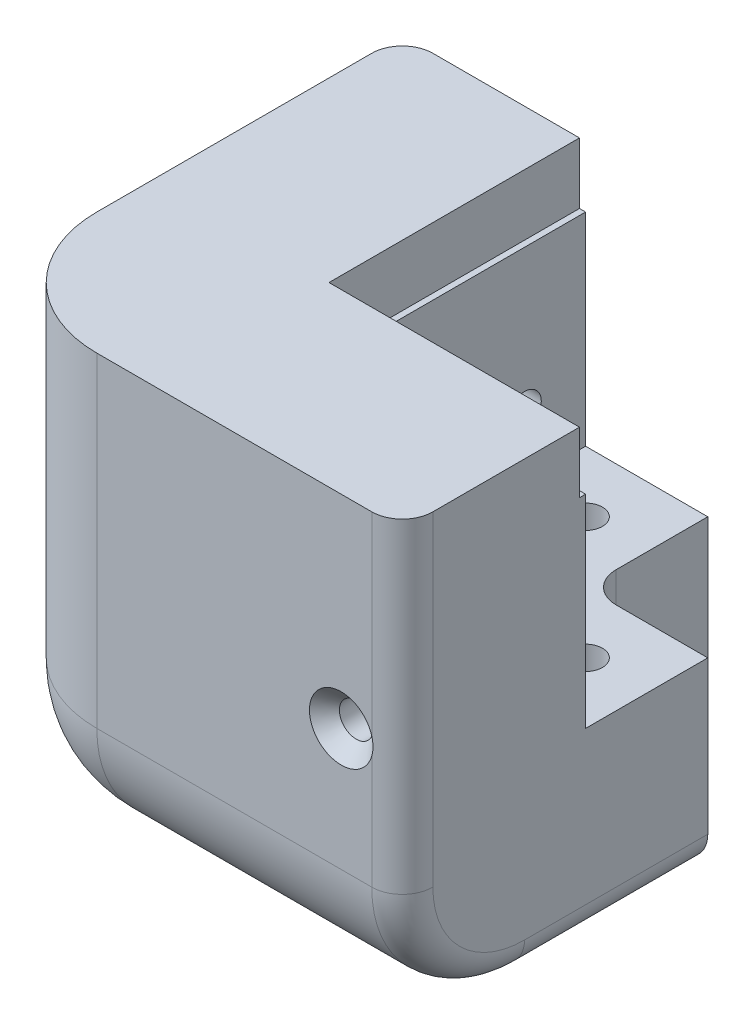
ISO-10303-21;
HEADER;
FILE_DESCRIPTION(('STEP AP214'),'2;1');
FILE_NAME('part.step','',(''),(''),'','','');
FILE_SCHEMA(('AUTOMOTIVE_DESIGN { 1 0 10303 214 1 1 1 1 }'));
ENDSEC;
DATA;
#1=APPLICATION_CONTEXT('core data for automotive mechanical design processes');
#2=APPLICATION_PROTOCOL_DEFINITION('international standard','automotive_design',2000,#1);
#3=PRODUCT_CONTEXT('',#1,'mechanical');
#4=PRODUCT('Part','Part','',(#3));
#5=PRODUCT_RELATED_PRODUCT_CATEGORY('part','',(#4));
#6=PRODUCT_DEFINITION_FORMATION('','',#4);
#7=PRODUCT_DEFINITION_CONTEXT('part definition',#1,'design');
#8=PRODUCT_DEFINITION('design','',#6,#7);
#9=PRODUCT_DEFINITION_SHAPE('','',#8);
#10=(LENGTH_UNIT() NAMED_UNIT(*) SI_UNIT(.MILLI.,.METRE.));
#11=(NAMED_UNIT(*) PLANE_ANGLE_UNIT() SI_UNIT($,.RADIAN.));
#12=(NAMED_UNIT(*) SI_UNIT($,.STERADIAN.) SOLID_ANGLE_UNIT());
#13=UNCERTAINTY_MEASURE_WITH_UNIT(LENGTH_MEASURE(1.E-05),#10,'distance_accuracy_value','');
#14=(GEOMETRIC_REPRESENTATION_CONTEXT(3) GLOBAL_UNCERTAINTY_ASSIGNED_CONTEXT((#13)) GLOBAL_UNIT_ASSIGNED_CONTEXT((#10,
#11,#12)) REPRESENTATION_CONTEXT('',''));
#15=CARTESIAN_POINT('',(0.,0.,0.));
#16=DIRECTION('',(0.,0.,1.));
#17=DIRECTION('',(1.,0.,0.));
#18=AXIS2_PLACEMENT_3D('',#15,#16,#17);
#19=CARTESIAN_POINT('',(0.,0.,0.));
#20=DIRECTION('',(0.,1.,0.));
#21=DIRECTION('',(0.,0.,1.));
#22=AXIS2_PLACEMENT_3D('',#19,#20,#21);
#23=PLANE('',#22);
#24=CARTESIAN_POINT('',(30.0000000000001,0.,-10.));
#25=DIRECTION('',(0.,1.,0.));
#26=DIRECTION('',(0.,0.,1.));
#27=AXIS2_PLACEMENT_3D('',#24,#25,#26);
#28=CIRCLE('',#27,2.74999999999999);
#29=CARTESIAN_POINT('',(30.0000000000001,0.,-7.25000000000001));
#30=VERTEX_POINT('',#29);
#31=EDGE_CURVE('E274',#30,#30,#28,.T.);
#32=ORIENTED_EDGE('',*,*,#31,.F.);
#33=EDGE_LOOP('',(#32));
#34=FACE_BOUND('',#33,.T.);
#35=DIRECTION('',(1.,0.,0.));
#36=VECTOR('',#35,1.);
#37=CARTESIAN_POINT('',(0.,0.,-20.));
#38=LINE('',#37,#36);
#39=CARTESIAN_POINT('',(25.0000000000003,0.,-20.));
#40=VERTEX_POINT('',#39);
#41=CARTESIAN_POINT('',(40.,0.,-20.));
#42=VERTEX_POINT('',#41);
#43=EDGE_CURVE('E290',#40,#42,#38,.T.);
#44=ORIENTED_EDGE('',*,*,#43,.F.);
#45=CARTESIAN_POINT('',(25.0000000000003,0.,-25.));
#46=DIRECTION('',(0.,1.,0.));
#47=DIRECTION('',(0.,0.,1.));
#48=AXIS2_PLACEMENT_3D('',#45,#46,#47);
#49=CIRCLE('',#48,5.);
#50=CARTESIAN_POINT('',(20.0000000000003,0.,-25.0000000000001));
#51=VERTEX_POINT('',#50);
#52=EDGE_CURVE('E52',#40,#51,#49,.F.);
#53=ORIENTED_EDGE('',*,*,#52,.T.);
#54=DIRECTION('',(0.,0.,-1.));
#55=VECTOR('',#54,1.);
#56=CARTESIAN_POINT('',(20.,0.,2.08721928629529E-13));
#57=LINE('',#56,#55);
#58=CARTESIAN_POINT('',(20.0000000000004,0.,-39.9999999999998));
#59=VERTEX_POINT('',#58);
#60=EDGE_CURVE('E235',#51,#59,#57,.T.);
#61=ORIENTED_EDGE('',*,*,#60,.T.);
#62=DIRECTION('',(1.,0.,0.));
#63=VECTOR('',#62,1.);
#64=CARTESIAN_POINT('',(4.08562073062058E-13,0.,-40.));
#65=LINE('',#64,#63);
#66=CARTESIAN_POINT('',(4.08562073062058E-13,0.,-40.));
#67=VERTEX_POINT('',#66);
#68=EDGE_CURVE('E247',#67,#59,#65,.T.);
#69=ORIENTED_EDGE('',*,*,#68,.F.);
#70=DIRECTION('',(0.,0.,-1.));
#71=VECTOR('',#70,1.);
#72=CARTESIAN_POINT('',(0.,0.,0.));
#73=LINE('',#72,#71);
#74=CARTESIAN_POINT('',(0.,0.,0.));
#75=VERTEX_POINT('',#74);
#76=EDGE_CURVE('E241',#75,#67,#73,.T.);
#77=ORIENTED_EDGE('',*,*,#76,.F.);
#78=DIRECTION('',(1.,0.,0.));
#79=VECTOR('',#78,1.);
#80=CARTESIAN_POINT('',(0.,0.,0.));
#81=LINE('',#80,#79);
#82=CARTESIAN_POINT('',(40.,0.,0.));
#83=VERTEX_POINT('',#82);
#84=EDGE_CURVE('E232',#75,#83,#81,.T.);
#85=ORIENTED_EDGE('',*,*,#84,.T.);
#86=DIRECTION('',(0.,0.,-1.));
#87=VECTOR('',#86,1.);
#88=CARTESIAN_POINT('',(40.,0.,0.));
#89=LINE('',#88,#87);
#90=EDGE_CURVE('E295',#83,#42,#89,.T.);
#91=ORIENTED_EDGE('',*,*,#90,.T.);
#92=EDGE_LOOP('',(#44,#53,#61,#69,#77,#85,#91));
#93=FACE_BOUND('',#92,.T.);
#94=CARTESIAN_POINT('',(10.0000000000003,0.,-30.));
#95=DIRECTION('',(0.,-1.,0.));
#96=DIRECTION('',(-1.,0.,0.));
#97=AXIS2_PLACEMENT_3D('',#94,#95,#96);
#98=CIRCLE('',#97,2.74999999999999);
#99=CARTESIAN_POINT('',(7.25000000000032,0.,-30.));
#100=VERTEX_POINT('',#99);
#101=EDGE_CURVE('E257',#100,#100,#98,.T.);
#102=ORIENTED_EDGE('',*,*,#101,.T.);
#103=EDGE_LOOP('',(#102));
#104=FACE_BOUND('',#103,.T.);
#105=ADVANCED_FACE('F43',(#34,#93,#104),#23,.T.);
#106=CARTESIAN_POINT('',(0.,-30.,-20.));
#107=DIRECTION('',(0.,0.,1.));
#108=DIRECTION('',(1.,0.,0.));
#109=AXIS2_PLACEMENT_3D('',#106,#107,#108);
#110=PLANE('',#109);
#111=DIRECTION('',(0.,1.,0.));
#112=VECTOR('',#111,1.);
#113=CARTESIAN_POINT('',(40.,-30.,-20.));
#114=LINE('',#113,#112);
#115=CARTESIAN_POINT('',(40.,-25.,-20.));
#116=VERTEX_POINT('',#115);
#117=EDGE_CURVE('E294',#116,#42,#114,.T.);
#118=ORIENTED_EDGE('',*,*,#117,.F.);
#119=CARTESIAN_POINT('',(35.,-25.,-20.));
#120=DIRECTION('',(0.,0.,1.));
#121=DIRECTION('',(1.,0.,0.));
#122=AXIS2_PLACEMENT_3D('',#119,#120,#121);
#123=CIRCLE('',#122,5.);
#124=CARTESIAN_POINT('',(35.,-30.,-20.));
#125=VERTEX_POINT('',#124);
#126=EDGE_CURVE('E407',#116,#125,#123,.F.);
#127=ORIENTED_EDGE('',*,*,#126,.T.);
#128=DIRECTION('',(1.,0.,0.));
#129=VECTOR('',#128,1.);
#130=CARTESIAN_POINT('',(0.,-30.,-20.));
#131=LINE('',#130,#129);
#132=CARTESIAN_POINT('',(25.0000000000003,-30.,-20.));
#133=VERTEX_POINT('',#132);
#134=EDGE_CURVE('E291',#133,#125,#131,.T.);
#135=ORIENTED_EDGE('',*,*,#134,.F.);
#136=DIRECTION('',(0.,1.,0.));
#137=VECTOR('',#136,1.);
#138=CARTESIAN_POINT('',(25.0000000000003,0.,-20.));
#139=LINE('',#138,#137);
#140=EDGE_CURVE('E532',#133,#40,#139,.T.);
#141=ORIENTED_EDGE('',*,*,#140,.T.);
#142=ORIENTED_EDGE('',*,*,#43,.T.);
#143=EDGE_LOOP('',(#118,#127,#135,#141,#142));
#144=FACE_BOUND('',#143,.T.);
#145=ADVANCED_FACE('F448',(#144),#110,.F.);
#146=CARTESIAN_POINT('',(40.,-30.,0.));
#147=DIRECTION('',(1.,0.,0.));
#148=DIRECTION('',(0.,0.,-1.));
#149=AXIS2_PLACEMENT_3D('',#146,#147,#148);
#150=PLANE('',#149);
#151=CARTESIAN_POINT('',(40.,-10.,10.));
#152=DIRECTION('',(1.,0.,0.));
#153=DIRECTION('',(0.,0.,-1.));
#154=AXIS2_PLACEMENT_3D('',#151,#152,#153);
#155=CIRCLE('',#154,15.);
#156=CARTESIAN_POINT('',(40.,-10.,25.));
#157=VERTEX_POINT('',#156);
#158=CARTESIAN_POINT('',(40.,-25.,10.));
#159=VERTEX_POINT('',#158);
#160=EDGE_CURVE('E522',#157,#159,#155,.T.);
#161=ORIENTED_EDGE('',*,*,#160,.T.);
#162=DIRECTION('',(0.,0.,-1.));
#163=VECTOR('',#162,1.);
#164=CARTESIAN_POINT('',(40.,-25.,-20.));
#165=LINE('',#164,#163);
#166=EDGE_CURVE('E529',#159,#116,#165,.T.);
#167=ORIENTED_EDGE('',*,*,#166,.T.);
#168=ORIENTED_EDGE('',*,*,#117,.T.);
#169=ORIENTED_EDGE('',*,*,#90,.F.);
#170=DIRECTION('',(0.,-1.,0.));
#171=VECTOR('',#170,1.);
#172=CARTESIAN_POINT('',(40.,43.2,0.));
#173=LINE('',#172,#171);
#174=CARTESIAN_POINT('',(40.,33.2,0.));
#175=VERTEX_POINT('',#174);
#176=EDGE_CURVE('E287',#175,#83,#173,.T.);
#177=ORIENTED_EDGE('',*,*,#176,.F.);
#178=DIRECTION('',(0.,0.,-1.));
#179=VECTOR('',#178,1.);
#180=CARTESIAN_POINT('',(40.,33.2,1.));
#181=LINE('',#180,#179);
#182=CARTESIAN_POINT('',(40.,33.2,1.));
#183=VERTEX_POINT('',#182);
#184=EDGE_CURVE('E222',#183,#175,#181,.T.);
#185=ORIENTED_EDGE('',*,*,#184,.F.);
#186=DIRECTION('',(0.,1.,0.));
#187=VECTOR('',#186,1.);
#188=CARTESIAN_POINT('',(40.,33.2,1.));
#189=LINE('',#188,#187);
#190=CARTESIAN_POINT('',(40.,43.2,1.));
#191=VERTEX_POINT('',#190);
#192=EDGE_CURVE('E264',#183,#191,#189,.T.);
#193=ORIENTED_EDGE('',*,*,#192,.T.);
#194=DIRECTION('',(0.,0.,1.));
#195=VECTOR('',#194,1.);
#196=CARTESIAN_POINT('',(40.,43.2,0.));
#197=LINE('',#196,#195);
#198=CARTESIAN_POINT('',(40.,43.2,25.));
#199=VERTEX_POINT('',#198);
#200=EDGE_CURVE('E281',#191,#199,#197,.T.);
#201=ORIENTED_EDGE('',*,*,#200,.T.);
#202=DIRECTION('',(0.,1.,0.));
#203=VECTOR('',#202,1.);
#204=CARTESIAN_POINT('',(40.,-30.,25.));
#205=LINE('',#204,#203);
#206=EDGE_CURVE('E380',#199,#157,#205,.F.);
#207=ORIENTED_EDGE('',*,*,#206,.T.);
#208=EDGE_LOOP('',(#161,#167,#168,#169,#177,#185,#193,#201,#207));
#209=FACE_BOUND('',#208,.T.);
#210=ADVANCED_FACE('F455',(#209),#150,.T.);
#211=CARTESIAN_POINT('',(0.,-30.,30.));
#212=DIRECTION('',(0.,0.,1.));
#213=DIRECTION('',(1.,0.,0.));
#214=AXIS2_PLACEMENT_3D('',#211,#212,#213);
#215=PLANE('',#214);
#216=DIRECTION('',(1.,0.,0.));
#217=VECTOR('',#216,1.);
#218=CARTESIAN_POINT('',(40.,-10.,30.));
#219=LINE('',#218,#217);
#220=CARTESIAN_POINT('',(-10.0000000000001,-10.,30.));
#221=VERTEX_POINT('',#220);
#222=CARTESIAN_POINT('',(35.,-10.,30.));
#223=VERTEX_POINT('',#222);
#224=EDGE_CURVE('E307',#221,#223,#219,.T.);
#225=ORIENTED_EDGE('',*,*,#224,.T.);
#226=DIRECTION('',(0.,1.,0.));
#227=VECTOR('',#226,1.);
#228=CARTESIAN_POINT('',(35.,-30.,30.));
#229=LINE('',#228,#227);
#230=CARTESIAN_POINT('',(35.,8.57171431429107,30.));
#231=VERTEX_POINT('',#230);
#232=EDGE_CURVE('E60',#223,#231,#229,.T.);
#233=ORIENTED_EDGE('',*,*,#232,.T.);
#234=CARTESIAN_POINT('',(30.0000000000001,10.,30.));
#235=DIRECTION('',(0.,0.,1.));
#236=DIRECTION('',(1.,0.,0.));
#237=AXIS2_PLACEMENT_3D('',#234,#235,#236);
#238=CIRCLE('',#237,5.2);
#239=CARTESIAN_POINT('',(35.,11.4282856857089,30.));
#240=VERTEX_POINT('',#239);
#241=EDGE_CURVE('E275',#240,#231,#238,.T.);
#242=ORIENTED_EDGE('',*,*,#241,.F.);
#243=DIRECTION('',(0.,1.,0.));
#244=VECTOR('',#243,1.);
#245=CARTESIAN_POINT('',(35.,-30.,30.));
#246=LINE('',#245,#244);
#247=CARTESIAN_POINT('',(35.,43.2,30.));
#248=VERTEX_POINT('',#247);
#249=EDGE_CURVE('E508',#240,#248,#246,.T.);
#250=ORIENTED_EDGE('',*,*,#249,.T.);
#251=DIRECTION('',(1.,0.,0.));
#252=VECTOR('',#251,1.);
#253=CARTESIAN_POINT('',(0.,43.2,30.));
#254=LINE('',#253,#252);
#255=CARTESIAN_POINT('',(-10.0000000000001,43.2,30.));
#256=VERTEX_POINT('',#255);
#257=EDGE_CURVE('E284',#256,#248,#254,.T.);
#258=ORIENTED_EDGE('',*,*,#257,.F.);
#259=DIRECTION('',(0.,1.,0.));
#260=VECTOR('',#259,1.);
#261=CARTESIAN_POINT('',(-10.0000000000001,-30.,30.));
#262=LINE('',#261,#260);
#263=EDGE_CURVE('E301',#256,#221,#262,.F.);
#264=ORIENTED_EDGE('',*,*,#263,.T.);
#265=EDGE_LOOP('',(#225,#233,#242,#250,#258,#264));
#266=FACE_BOUND('',#265,.T.);
#267=ADVANCED_FACE('F466',(#266),#215,.T.);
#268=CARTESIAN_POINT('',(0.,-30.,0.));
#269=DIRECTION('',(0.,1.,0.));
#270=DIRECTION('',(0.,0.,1.));
#271=AXIS2_PLACEMENT_3D('',#268,#269,#270);
#272=PLANE('',#271);
#273=DIRECTION('',(0.,0.,-1.));
#274=VECTOR('',#273,1.);
#275=CARTESIAN_POINT('',(-9.99999999999958,-30.,-40.0000000000001));
#276=LINE('',#275,#274);
#277=CARTESIAN_POINT('',(-10.0000000000001,-30.,10.));
#278=VERTEX_POINT('',#277);
#279=CARTESIAN_POINT('',(-9.99999999999963,-30.,-35.0000000000001));
#280=VERTEX_POINT('',#279);
#281=EDGE_CURVE('E309',#278,#280,#276,.T.);
#282=ORIENTED_EDGE('',*,*,#281,.T.);
#283=DIRECTION('',(1.,0.,0.));
#284=VECTOR('',#283,1.);
#285=CARTESIAN_POINT('',(20.0000000000004,-30.,-34.9999999999998));
#286=LINE('',#285,#284);
#287=CARTESIAN_POINT('',(8.57171431429145,-30.,-34.9999999999999));
#288=VERTEX_POINT('',#287);
#289=EDGE_CURVE('E336',#280,#288,#286,.T.);
#290=ORIENTED_EDGE('',*,*,#289,.T.);
#291=CARTESIAN_POINT('',(10.0000000000003,-30.,-30.));
#292=DIRECTION('',(0.,1.,0.));
#293=DIRECTION('',(1.,0.,0.));
#294=AXIS2_PLACEMENT_3D('',#291,#292,#293);
#295=CIRCLE('',#294,5.2);
#296=CARTESIAN_POINT('',(11.4282856857093,-30.,-34.9999999999999));
#297=VERTEX_POINT('',#296);
#298=EDGE_CURVE('E578',#288,#297,#295,.T.);
#299=ORIENTED_EDGE('',*,*,#298,.T.);
#300=DIRECTION('',(1.,0.,0.));
#301=VECTOR('',#300,1.);
#302=CARTESIAN_POINT('',(20.0000000000004,-30.,-34.9999999999998));
#303=LINE('',#302,#301);
#304=CARTESIAN_POINT('',(20.0000000000004,-30.,-34.9999999999998));
#305=VERTEX_POINT('',#304);
#306=EDGE_CURVE('E334',#297,#305,#303,.T.);
#307=ORIENTED_EDGE('',*,*,#306,.T.);
#308=DIRECTION('',(0.,0.,-1.));
#309=VECTOR('',#308,1.);
#310=CARTESIAN_POINT('',(20.,-30.,2.08721928629529E-13));
#311=LINE('',#310,#309);
#312=CARTESIAN_POINT('',(20.0000000000003,-30.,-25.0000000000001));
#313=VERTEX_POINT('',#312);
#314=EDGE_CURVE('E243',#313,#305,#311,.T.);
#315=ORIENTED_EDGE('',*,*,#314,.F.);
#316=CARTESIAN_POINT('',(25.0000000000003,-30.,-25.));
#317=DIRECTION('',(0.,1.,0.));
#318=DIRECTION('',(0.,0.,1.));
#319=AXIS2_PLACEMENT_3D('',#316,#317,#318);
#320=CIRCLE('',#319,5.);
#321=EDGE_CURVE('E11',#313,#133,#320,.T.);
#322=ORIENTED_EDGE('',*,*,#321,.T.);
#323=ORIENTED_EDGE('',*,*,#134,.T.);
#324=DIRECTION('',(0.,0.,-1.));
#325=VECTOR('',#324,1.);
#326=CARTESIAN_POINT('',(35.,-30.,10.));
#327=LINE('',#326,#325);
#328=CARTESIAN_POINT('',(35.,-30.,-11.4282856857089));
#329=VERTEX_POINT('',#328);
#330=EDGE_CURVE('E332',#125,#329,#327,.F.);
#331=ORIENTED_EDGE('',*,*,#330,.T.);
#332=CARTESIAN_POINT('',(30.0000000000001,-30.,-10.));
#333=DIRECTION('',(0.,-1.,0.));
#334=DIRECTION('',(0.,0.,-1.));
#335=AXIS2_PLACEMENT_3D('',#332,#333,#334);
#336=CIRCLE('',#335,5.2);
#337=CARTESIAN_POINT('',(35.,-30.,-8.57171431429107));
#338=VERTEX_POINT('',#337);
#339=EDGE_CURVE('E268',#338,#329,#336,.T.);
#340=ORIENTED_EDGE('',*,*,#339,.F.);
#341=DIRECTION('',(0.,0.,-1.));
#342=VECTOR('',#341,1.);
#343=CARTESIAN_POINT('',(35.,-30.,10.));
#344=LINE('',#343,#342);
#345=CARTESIAN_POINT('',(35.,-30.,10.));
#346=VERTEX_POINT('',#345);
#347=EDGE_CURVE('E320',#338,#346,#344,.F.);
#348=ORIENTED_EDGE('',*,*,#347,.T.);
#349=DIRECTION('',(1.,0.,0.));
#350=VECTOR('',#349,1.);
#351=CARTESIAN_POINT('',(-30.0000000000003,-30.,10.));
#352=LINE('',#351,#350);
#353=EDGE_CURVE('E312',#346,#278,#352,.F.);
#354=ORIENTED_EDGE('',*,*,#353,.T.);
#355=EDGE_LOOP('',(#282,#290,#299,#307,#315,#322,#323,#331,#340,#348,#354));
#356=FACE_BOUND('',#355,.T.);
#357=ADVANCED_FACE('F462',(#356),#272,.F.);
#358=CARTESIAN_POINT('',(0.,43.2,0.));
#359=DIRECTION('',(0.,0.,-1.));
#360=DIRECTION('',(-1.,0.,0.));
#361=AXIS2_PLACEMENT_3D('',#358,#359,#360);
#362=PLANE('',#361);
#363=DIRECTION('',(-1.,0.,0.));
#364=VECTOR('',#363,1.);
#365=CARTESIAN_POINT('',(40.,33.2,0.));
#366=LINE('',#365,#364);
#367=CARTESIAN_POINT('',(0.,33.2,0.));
#368=VERTEX_POINT('',#367);
#369=EDGE_CURVE('E218',#175,#368,#366,.T.);
#370=ORIENTED_EDGE('',*,*,#369,.F.);
#371=ORIENTED_EDGE('',*,*,#176,.T.);
#372=ORIENTED_EDGE('',*,*,#84,.F.);
#373=DIRECTION('',(0.,-1.,0.));
#374=VECTOR('',#373,1.);
#375=CARTESIAN_POINT('',(0.,43.2,0.));
#376=LINE('',#375,#374);
#377=EDGE_CURVE('E208',#368,#75,#376,.T.);
#378=ORIENTED_EDGE('',*,*,#377,.F.);
#379=EDGE_LOOP('',(#370,#371,#372,#378));
#380=FACE_BOUND('',#379,.T.);
#381=CARTESIAN_POINT('',(30.0000000000001,10.,0.));
#382=DIRECTION('',(0.,0.,-1.));
#383=DIRECTION('',(-1.,0.,0.));
#384=AXIS2_PLACEMENT_3D('',#381,#382,#383);
#385=CIRCLE('',#384,2.74999999999999);
#386=CARTESIAN_POINT('',(27.2500000000001,10.,0.));
#387=VERTEX_POINT('',#386);
#388=EDGE_CURVE('E280',#387,#387,#385,.T.);
#389=ORIENTED_EDGE('',*,*,#388,.F.);
#390=EDGE_LOOP('',(#389));
#391=FACE_BOUND('',#390,.T.);
#392=ADVANCED_FACE('F229',(#380,#391),#362,.T.);
#393=CARTESIAN_POINT('',(0.,43.2,0.));
#394=DIRECTION('',(0.,1.,0.));
#395=DIRECTION('',(0.,0.,1.));
#396=AXIS2_PLACEMENT_3D('',#393,#394,#395);
#397=PLANE('',#396);
#398=DIRECTION('',(-1.,0.,0.));
#399=VECTOR('',#398,1.);
#400=CARTESIAN_POINT('',(4.17813931600601E-13,43.2,-40.));
#401=LINE('',#400,#399);
#402=CARTESIAN_POINT('',(-0.999999999999591,43.2,-40.));
#403=VERTEX_POINT('',#402);
#404=CARTESIAN_POINT('',(-24.9999999999996,43.2,-40.0000000000003));
#405=VERTEX_POINT('',#404);
#406=EDGE_CURVE('E238',#403,#405,#401,.T.);
#407=ORIENTED_EDGE('',*,*,#406,.T.);
#408=CARTESIAN_POINT('',(-24.9999999999996,43.2,-35.0000000000003));
#409=DIRECTION('',(0.,1.,0.));
#410=DIRECTION('',(0.,0.,1.));
#411=AXIS2_PLACEMENT_3D('',#408,#409,#410);
#412=CIRCLE('',#411,5.);
#413=CARTESIAN_POINT('',(-29.9999999999996,43.2,-35.0000000000003));
#414=VERTEX_POINT('',#413);
#415=EDGE_CURVE('E539',#405,#414,#412,.T.);
#416=ORIENTED_EDGE('',*,*,#415,.T.);
#417=DIRECTION('',(0.,0.,-1.));
#418=VECTOR('',#417,1.);
#419=CARTESIAN_POINT('',(-30.,43.2,-3.13082892944294E-13));
#420=LINE('',#419,#418);
#421=CARTESIAN_POINT('',(-30.0000000000001,43.2,9.99999999999979));
#422=VERTEX_POINT('',#421);
#423=EDGE_CURVE('E233',#422,#414,#420,.T.);
#424=ORIENTED_EDGE('',*,*,#423,.F.);
#425=CARTESIAN_POINT('',(-10.0000000000001,43.2,10.));
#426=DIRECTION('',(0.,1.,0.));
#427=DIRECTION('',(0.,0.,1.));
#428=AXIS2_PLACEMENT_3D('',#425,#426,#427);
#429=CIRCLE('',#428,20.);
#430=EDGE_CURVE('E318',#422,#256,#429,.T.);
#431=ORIENTED_EDGE('',*,*,#430,.T.);
#432=ORIENTED_EDGE('',*,*,#257,.T.);
#433=CARTESIAN_POINT('',(35.,43.2,25.));
#434=DIRECTION('',(0.,1.,0.));
#435=DIRECTION('',(0.,0.,1.));
#436=AXIS2_PLACEMENT_3D('',#433,#434,#435);
#437=CIRCLE('',#436,5.);
#438=EDGE_CURVE('E537',#248,#199,#437,.T.);
#439=ORIENTED_EDGE('',*,*,#438,.T.);
#440=ORIENTED_EDGE('',*,*,#200,.F.);
#441=DIRECTION('',(1.,0.,0.));
#442=VECTOR('',#441,1.);
#443=CARTESIAN_POINT('',(-1.,43.2,1.));
#444=LINE('',#443,#442);
#445=CARTESIAN_POINT('',(-1.,43.2,0.999999999999999));
#446=VERTEX_POINT('',#445);
#447=EDGE_CURVE('E226',#446,#191,#444,.T.);
#448=ORIENTED_EDGE('',*,*,#447,.F.);
#449=DIRECTION('',(0.,0.,-1.));
#450=VECTOR('',#449,1.);
#451=CARTESIAN_POINT('',(-1.00000000000001,43.2,0.99999999999999));
#452=LINE('',#451,#450);
#453=EDGE_CURVE('E215',#446,#403,#452,.T.);
#454=ORIENTED_EDGE('',*,*,#453,.T.);
#455=EDGE_LOOP('',(#407,#416,#424,#431,#432,#439,#440,#448,#454));
#456=FACE_BOUND('',#455,.T.);
#457=ADVANCED_FACE('F590',(#456),#397,.T.);
#458=CARTESIAN_POINT('',(30.0000000000001,10.,30.));
#459=DIRECTION('',(0.,0.,1.));
#460=DIRECTION('',(1.,0.,0.));
#461=AXIS2_PLACEMENT_3D('',#458,#459,#460);
#462=CYLINDRICAL_SURFACE('',#461,2.74999999999999);
#463=ORIENTED_EDGE('',*,*,#388,.T.);
#464=EDGE_LOOP('',(#463));
#465=FACE_BOUND('',#464,.T.);
#466=CARTESIAN_POINT('',(30.0000000000001,10.,27.55));
#467=DIRECTION('',(0.,0.,1.));
#468=DIRECTION('',(1.,0.,0.));
#469=AXIS2_PLACEMENT_3D('',#466,#467,#468);
#470=CIRCLE('',#469,2.75);
#471=CARTESIAN_POINT('',(32.7500000000001,10.,27.55));
#472=VERTEX_POINT('',#471);
#473=EDGE_CURVE('E277',#472,#472,#470,.T.);
#474=ORIENTED_EDGE('',*,*,#473,.T.);
#475=EDGE_LOOP('',(#474));
#476=FACE_BOUND('',#475,.T.);
#477=ADVANCED_FACE('F426',(#465,#476),#462,.F.);
#478=CARTESIAN_POINT('',(30.0000000000001,10.,30.));
#479=DIRECTION('',(0.,0.,1.));
#480=DIRECTION('',(1.,0.,0.));
#481=AXIS2_PLACEMENT_3D('',#478,#479,#480);
#482=CONICAL_SURFACE('',#481,5.2,0.78539816339745);
#483=ORIENTED_EDGE('',*,*,#473,.F.);
#484=EDGE_LOOP('',(#483));
#485=FACE_BOUND('',#484,.T.);
#486=ORIENTED_EDGE('',*,*,#241,.T.);
#487=CARTESIAN_POINT('',(35.,8.57171431429107,30.));
#488=CARTESIAN_POINT('',(35.0357308623741,8.69688798329789,29.9999659521449));
#489=CARTESIAN_POINT('',(35.0664315681125,8.82345992009412,29.9996162125323));
#490=CARTESIAN_POINT('',(35.1180196107553,9.07854796836962,29.9986825278218));
#491=CARTESIAN_POINT('',(35.138910274522,9.20706340546951,29.9980986622474));
#492=CARTESIAN_POINT('',(35.1708352124053,9.46275829431852,29.9971031292521));
#493=CARTESIAN_POINT('',(35.1820534849411,9.58991503437084,29.9966883302381));
#494=CARTESIAN_POINT('',(35.1954299130366,9.8447153205809,29.9961844444697));
#495=CARTESIAN_POINT('',(35.1975875111163,9.97235889620879,29.996095377757));
#496=CARTESIAN_POINT('',(35.1931678252216,10.2111380325767,29.9962672783304));
#497=CARTESIAN_POINT('',(35.1876733919417,10.3222950383464,29.9964848950998));
#498=CARTESIAN_POINT('',(35.1697685086706,10.5440307342608,29.9971248276291));
#499=CARTESIAN_POINT('',(35.1573594730514,10.6546095380084,29.9975471015245));
#500=CARTESIAN_POINT('',(35.125253816989,10.8766652065422,29.998458615989));
#501=CARTESIAN_POINT('',(35.1054348216758,10.9881245068676,29.9989488888027));
#502=CARTESIAN_POINT('',(35.0583498970599,11.2095064131317,29.9997097484112));
#503=CARTESIAN_POINT('',(35.0310807654056,11.3194283368403,29.9999802405369));
#504=CARTESIAN_POINT('',(35.0000000000001,11.4282856857089,30.0000000000001));
#505=B_SPLINE_CURVE_WITH_KNOTS('',3,(#487,#488,#489,#490,#491,#492,#493,#494,#495,#496,#497,
#498,#499,#500,#501,#502,#503,#504),.UNSPECIFIED.,.F.,.F.,(4,2,2,2,2,2,2,2,4),(0.,
0.390364105354003,0.780595731439321,1.16322895378752,1.54588571823489,1.87955606244367,
2.21315817990749,2.55253227325721,2.89205247262082),.UNSPECIFIED.);
#506=EDGE_CURVE('E66',#231,#240,#505,.T.);
#507=ORIENTED_EDGE('',*,*,#506,.T.);
#508=EDGE_LOOP('',(#486,#507));
#509=FACE_BOUND('',#508,.T.);
#510=ADVANCED_FACE('F421',(#485,#509),#482,.F.);
#511=CARTESIAN_POINT('',(30.0000000000001,-30.,-10.));
#512=DIRECTION('',(0.,-1.,0.));
#513=DIRECTION('',(0.,0.,-1.));
#514=AXIS2_PLACEMENT_3D('',#511,#512,#513);
#515=CYLINDRICAL_SURFACE('',#514,2.74999999999999);
#516=ORIENTED_EDGE('',*,*,#31,.T.);
#517=EDGE_LOOP('',(#516));
#518=FACE_BOUND('',#517,.T.);
#519=CARTESIAN_POINT('',(30.0000000000001,-27.55,-10.));
#520=DIRECTION('',(0.,-1.,0.));
#521=DIRECTION('',(0.,0.,-1.));
#522=AXIS2_PLACEMENT_3D('',#519,#520,#521);
#523=CIRCLE('',#522,2.74999999999999);
#524=CARTESIAN_POINT('',(30.0000000000001,-27.55,-12.75));
#525=VERTEX_POINT('',#524);
#526=EDGE_CURVE('E271',#525,#525,#523,.T.);
#527=ORIENTED_EDGE('',*,*,#526,.T.);
#528=EDGE_LOOP('',(#527));
#529=FACE_BOUND('',#528,.T.);
#530=ADVANCED_FACE('F416',(#518,#529),#515,.F.);
#531=CARTESIAN_POINT('',(30.0000000000001,-30.,-10.));
#532=DIRECTION('',(0.,-1.,0.));
#533=DIRECTION('',(0.,0.,-1.));
#534=AXIS2_PLACEMENT_3D('',#531,#532,#533);
#535=CONICAL_SURFACE('',#534,5.2,0.785398163397449);
#536=ORIENTED_EDGE('',*,*,#526,.F.);
#537=EDGE_LOOP('',(#536));
#538=FACE_BOUND('',#537,.T.);
#539=ORIENTED_EDGE('',*,*,#339,.T.);
#540=CARTESIAN_POINT('',(35.,-30.,-11.4282856857089));
#541=CARTESIAN_POINT('',(35.0357308623741,-29.9999659521449,-11.3031120167021));
#542=CARTESIAN_POINT('',(35.0664315681125,-29.9996162125323,-11.1765400799059));
#543=CARTESIAN_POINT('',(35.1180196107553,-29.9986825278218,-10.9214520316304));
#544=CARTESIAN_POINT('',(35.138910274522,-29.9980986622474,-10.7929365945305));
#545=CARTESIAN_POINT('',(35.1708352124053,-29.9971031292521,-10.5372417056815));
#546=CARTESIAN_POINT('',(35.1820534849411,-29.9966883302381,-10.4100849656292));
#547=CARTESIAN_POINT('',(35.1954299130366,-29.9961844444697,-10.1552846794191));
#548=CARTESIAN_POINT('',(35.1975875111163,-29.996095377757,-10.0276411037912));
#549=CARTESIAN_POINT('',(35.1931678252216,-29.9962672783304,-9.78886196742329));
#550=CARTESIAN_POINT('',(35.1876733919417,-29.9964848950998,-9.67770496165363));
#551=CARTESIAN_POINT('',(35.1697685086706,-29.9971248276291,-9.45596926573921));
#552=CARTESIAN_POINT('',(35.1573594730514,-29.9975471015245,-9.34539046199165));
#553=CARTESIAN_POINT('',(35.125253816989,-29.998458615989,-9.12333479345783));
#554=CARTESIAN_POINT('',(35.1054348216758,-29.9989488888027,-9.01187549313238));
#555=CARTESIAN_POINT('',(35.0583498970599,-29.9997097484112,-8.79049358686831));
#556=CARTESIAN_POINT('',(35.0310807654056,-29.9999802405369,-8.68057166315971));
#557=CARTESIAN_POINT('',(35.0000000000001,-30.0000000000001,-8.57171431429107));
#558=B_SPLINE_CURVE_WITH_KNOTS('',3,(#540,#541,#542,#543,#544,#545,#546,#547,#548,#549,#550,
#551,#552,#553,#554,#555,#556,#557),.UNSPECIFIED.,.F.,.F.,(4,2,2,2,2,2,2,2,4),(0.,
0.390364105354002,0.78059573143932,1.16322895378752,1.54588571823489,1.87955606244367,
2.21315817990749,2.55253227325721,2.89205247262082),.UNSPECIFIED.);
#559=EDGE_CURVE('E398',#329,#338,#558,.T.);
#560=ORIENTED_EDGE('',*,*,#559,.T.);
#561=EDGE_LOOP('',(#539,#560));
#562=FACE_BOUND('',#561,.T.);
#563=ADVANCED_FACE('F410',(#538,#562),#535,.F.);
#564=CARTESIAN_POINT('',(-1.,33.2,1.));
#565=DIRECTION('',(0.,0.,1.));
#566=DIRECTION('',(1.,0.,0.));
#567=AXIS2_PLACEMENT_3D('',#564,#565,#566);
#568=PLANE('',#567);
#569=ORIENTED_EDGE('',*,*,#447,.T.);
#570=ORIENTED_EDGE('',*,*,#192,.F.);
#571=DIRECTION('',(1.,0.,0.));
#572=VECTOR('',#571,1.);
#573=CARTESIAN_POINT('',(-1.,33.2,1.));
#574=LINE('',#573,#572);
#575=CARTESIAN_POINT('',(-1.00000000000001,33.2,0.99999999999999));
#576=VERTEX_POINT('',#575);
#577=EDGE_CURVE('E225',#576,#183,#574,.T.);
#578=ORIENTED_EDGE('',*,*,#577,.F.);
#579=DIRECTION('',(0.,1.,0.));
#580=VECTOR('',#579,1.);
#581=CARTESIAN_POINT('',(-1.00000000000001,33.2,0.99999999999999));
#582=LINE('',#581,#580);
#583=EDGE_CURVE('E571',#576,#446,#582,.T.);
#584=ORIENTED_EDGE('',*,*,#583,.T.);
#585=EDGE_LOOP('',(#569,#570,#578,#584));
#586=FACE_BOUND('',#585,.T.);
#587=ADVANCED_FACE('F415',(#586),#568,.F.);
#588=CARTESIAN_POINT('',(0.,33.2,0.));
#589=DIRECTION('',(0.,-1.,0.));
#590=DIRECTION('',(0.,0.,-1.));
#591=AXIS2_PLACEMENT_3D('',#588,#589,#590);
#592=PLANE('',#591);
#593=ORIENTED_EDGE('',*,*,#369,.T.);
#594=DIRECTION('',(0.,0.,1.));
#595=VECTOR('',#594,1.);
#596=CARTESIAN_POINT('',(4.08562073062058E-13,33.2,-40.));
#597=LINE('',#596,#595);
#598=CARTESIAN_POINT('',(4.08562073062058E-13,33.2,-40.));
#599=VERTEX_POINT('',#598);
#600=EDGE_CURVE('E202',#599,#368,#597,.T.);
#601=ORIENTED_EDGE('',*,*,#600,.F.);
#602=DIRECTION('',(1.,0.,0.));
#603=VECTOR('',#602,1.);
#604=CARTESIAN_POINT('',(-0.999999999999591,33.2,-40.));
#605=LINE('',#604,#603);
#606=CARTESIAN_POINT('',(-0.999999999999591,33.2,-40.));
#607=VERTEX_POINT('',#606);
#608=EDGE_CURVE('E568',#607,#599,#605,.T.);
#609=ORIENTED_EDGE('',*,*,#608,.F.);
#610=DIRECTION('',(0.,0.,-1.));
#611=VECTOR('',#610,1.);
#612=CARTESIAN_POINT('',(-1.00000000000001,33.2,0.99999999999999));
#613=LINE('',#612,#611);
#614=EDGE_CURVE('E214',#576,#607,#613,.T.);
#615=ORIENTED_EDGE('',*,*,#614,.F.);
#616=ORIENTED_EDGE('',*,*,#577,.T.);
#617=ORIENTED_EDGE('',*,*,#184,.T.);
#618=EDGE_LOOP('',(#593,#601,#609,#615,#616,#617));
#619=FACE_BOUND('',#618,.T.);
#620=ADVANCED_FACE('F219',(#619),#592,.F.);
#621=CARTESIAN_POINT('',(20.,-30.,2.08721928629529E-13));
#622=DIRECTION('',(-1.,0.,0.));
#623=DIRECTION('',(0.,0.,-1.));
#624=AXIS2_PLACEMENT_3D('',#621,#622,#623);
#625=PLANE('',#624);
#626=ORIENTED_EDGE('',*,*,#314,.T.);
#627=CARTESIAN_POINT('',(20.0000000000004,-25.,-34.9999999999998));
#628=DIRECTION('',(-1.,0.,0.));
#629=DIRECTION('',(0.,0.,1.));
#630=AXIS2_PLACEMENT_3D('',#627,#628,#629);
#631=CIRCLE('',#630,5.);
#632=CARTESIAN_POINT('',(20.0000000000004,-25.,-39.9999999999998));
#633=VERTEX_POINT('',#632);
#634=EDGE_CURVE('E752',#305,#633,#631,.F.);
#635=ORIENTED_EDGE('',*,*,#634,.T.);
#636=DIRECTION('',(0.,1.,0.));
#637=VECTOR('',#636,1.);
#638=CARTESIAN_POINT('',(20.0000000000004,-30.,-39.9999999999998));
#639=LINE('',#638,#637);
#640=EDGE_CURVE('E246',#633,#59,#639,.T.);
#641=ORIENTED_EDGE('',*,*,#640,.T.);
#642=ORIENTED_EDGE('',*,*,#60,.F.);
#643=DIRECTION('',(0.,1.,0.));
#644=VECTOR('',#643,1.);
#645=CARTESIAN_POINT('',(20.0000000000003,-30.,-25.0000000000001));
#646=LINE('',#645,#644);
#647=EDGE_CURVE('E347',#51,#313,#646,.F.);
#648=ORIENTED_EDGE('',*,*,#647,.T.);
#649=EDGE_LOOP('',(#626,#635,#641,#642,#648));
#650=FACE_BOUND('',#649,.T.);
#651=ADVANCED_FACE('F629',(#650),#625,.F.);
#652=CARTESIAN_POINT('',(4.08562073062058E-13,-30.,-40.));
#653=DIRECTION('',(0.,0.,-1.));
#654=DIRECTION('',(1.,0.,0.));
#655=AXIS2_PLACEMENT_3D('',#652,#653,#654);
#656=PLANE('',#655);
#657=ORIENTED_EDGE('',*,*,#640,.F.);
#658=DIRECTION('',(1.,0.,0.));
#659=VECTOR('',#658,1.);
#660=CARTESIAN_POINT('',(-9.99999999999958,-25.,-40.0000000000001));
#661=LINE('',#660,#659);
#662=CARTESIAN_POINT('',(-9.99999999999958,-25.,-40.0000000000001));
#663=VERTEX_POINT('',#662);
#664=EDGE_CURVE('E540',#633,#663,#661,.F.);
#665=ORIENTED_EDGE('',*,*,#664,.T.);
#666=CARTESIAN_POINT('',(-9.99999999999958,-10.,-40.0000000000001));
#667=DIRECTION('',(0.,0.,-1.));
#668=DIRECTION('',(-1.,0.,0.));
#669=AXIS2_PLACEMENT_3D('',#666,#667,#668);
#670=CIRCLE('',#669,15.);
#671=CARTESIAN_POINT('',(-24.9999999999996,-10.,-40.0000000000003));
#672=VERTEX_POINT('',#671);
#673=EDGE_CURVE('E753',#663,#672,#670,.T.);
#674=ORIENTED_EDGE('',*,*,#673,.T.);
#675=DIRECTION('',(0.,1.,0.));
#676=VECTOR('',#675,1.);
#677=CARTESIAN_POINT('',(-24.9999999999996,-30.,-40.0000000000003));
#678=LINE('',#677,#676);
#679=EDGE_CURVE('E500',#672,#405,#678,.T.);
#680=ORIENTED_EDGE('',*,*,#679,.T.);
#681=ORIENTED_EDGE('',*,*,#406,.F.);
#682=DIRECTION('',(0.,1.,0.));
#683=VECTOR('',#682,1.);
#684=CARTESIAN_POINT('',(-0.999999999999591,33.2,-40.));
#685=LINE('',#684,#683);
#686=EDGE_CURVE('E570',#607,#403,#685,.T.);
#687=ORIENTED_EDGE('',*,*,#686,.F.);
#688=ORIENTED_EDGE('',*,*,#608,.T.);
#689=DIRECTION('',(0.,-1.,0.));
#690=VECTOR('',#689,1.);
#691=CARTESIAN_POINT('',(4.08562073062058E-13,43.2,-40.));
#692=LINE('',#691,#690);
#693=EDGE_CURVE('E210',#599,#67,#692,.T.);
#694=ORIENTED_EDGE('',*,*,#693,.T.);
#695=ORIENTED_EDGE('',*,*,#68,.T.);
#696=EDGE_LOOP('',(#657,#665,#674,#680,#681,#687,#688,#694,#695));
#697=FACE_BOUND('',#696,.T.);
#698=ADVANCED_FACE('F565',(#697),#656,.T.);
#699=CARTESIAN_POINT('',(-30.,-30.,-3.13082892944294E-13));
#700=DIRECTION('',(-1.,0.,0.));
#701=DIRECTION('',(0.,0.,-1.));
#702=AXIS2_PLACEMENT_3D('',#699,#700,#701);
#703=PLANE('',#702);
#704=ORIENTED_EDGE('',*,*,#423,.T.);
#705=DIRECTION('',(0.,1.,0.));
#706=VECTOR('',#705,1.);
#707=CARTESIAN_POINT('',(-29.9999999999996,-30.,-35.0000000000003));
#708=LINE('',#707,#706);
#709=CARTESIAN_POINT('',(-29.9999999999996,11.4282856857089,-35.0000000000003));
#710=VERTEX_POINT('',#709);
#711=EDGE_CURVE('E381',#414,#710,#708,.F.);
#712=ORIENTED_EDGE('',*,*,#711,.T.);
#713=CARTESIAN_POINT('',(-29.9999999999997,10.,-30.0000000000004));
#714=DIRECTION('',(1.,0.,0.));
#715=DIRECTION('',(0.,0.,-1.));
#716=AXIS2_PLACEMENT_3D('',#713,#714,#715);
#717=CIRCLE('',#716,5.2);
#718=CARTESIAN_POINT('',(-29.9999999999996,8.57171431429107,-35.0000000000003));
#719=VERTEX_POINT('',#718);
#720=EDGE_CURVE('E259',#710,#719,#717,.T.);
#721=ORIENTED_EDGE('',*,*,#720,.T.);
#722=DIRECTION('',(0.,1.,0.));
#723=VECTOR('',#722,1.);
#724=CARTESIAN_POINT('',(-29.9999999999996,-30.,-35.0000000000003));
#725=LINE('',#724,#723);
#726=CARTESIAN_POINT('',(-29.9999999999996,-10.,-35.0000000000003));
#727=VERTEX_POINT('',#726);
#728=EDGE_CURVE('E499',#719,#727,#725,.F.);
#729=ORIENTED_EDGE('',*,*,#728,.T.);
#730=DIRECTION('',(0.,0.,-1.));
#731=VECTOR('',#730,1.);
#732=CARTESIAN_POINT('',(-30.0000000000003,-10.,30.));
#733=LINE('',#732,#731);
#734=CARTESIAN_POINT('',(-30.0000000000001,-10.,9.99999999999979));
#735=VERTEX_POINT('',#734);
#736=EDGE_CURVE('E316',#727,#735,#733,.F.);
#737=ORIENTED_EDGE('',*,*,#736,.T.);
#738=DIRECTION('',(0.,1.,0.));
#739=VECTOR('',#738,1.);
#740=CARTESIAN_POINT('',(-30.0000000000001,-30.,9.99999999999979));
#741=LINE('',#740,#739);
#742=EDGE_CURVE('E314',#735,#422,#741,.T.);
#743=ORIENTED_EDGE('',*,*,#742,.T.);
#744=EDGE_LOOP('',(#704,#712,#721,#729,#737,#743));
#745=FACE_BOUND('',#744,.T.);
#746=ADVANCED_FACE('F548',(#745),#703,.T.);
#747=CARTESIAN_POINT('',(0.,43.2,0.));
#748=DIRECTION('',(1.,0.,0.));
#749=DIRECTION('',(0.,0.,1.));
#750=AXIS2_PLACEMENT_3D('',#747,#748,#749);
#751=PLANE('',#750);
#752=ORIENTED_EDGE('',*,*,#600,.T.);
#753=ORIENTED_EDGE('',*,*,#377,.T.);
#754=ORIENTED_EDGE('',*,*,#76,.T.);
#755=ORIENTED_EDGE('',*,*,#693,.F.);
#756=EDGE_LOOP('',(#752,#753,#754,#755));
#757=FACE_BOUND('',#756,.T.);
#758=CARTESIAN_POINT('',(3.06421554796544E-13,10.,-30.0000000000001));
#759=DIRECTION('',(-1.,0.,0.));
#760=DIRECTION('',(0.,0.,1.));
#761=AXIS2_PLACEMENT_3D('',#758,#759,#760);
#762=CIRCLE('',#761,2.74999999999999);
#763=CARTESIAN_POINT('',(2.78332912273528E-13,10.,-27.2500000000001));
#764=VERTEX_POINT('',#763);
#765=EDGE_CURVE('E253',#764,#764,#762,.T.);
#766=ORIENTED_EDGE('',*,*,#765,.T.);
#767=EDGE_LOOP('',(#766));
#768=FACE_BOUND('',#767,.T.);
#769=ADVANCED_FACE('F204',(#757,#768),#751,.T.);
#770=CARTESIAN_POINT('',(-29.9999999999997,10.,-30.0000000000004));
#771=DIRECTION('',(-1.,0.,0.));
#772=DIRECTION('',(0.,0.,-1.));
#773=AXIS2_PLACEMENT_3D('',#770,#771,#772);
#774=CYLINDRICAL_SURFACE('',#773,2.74999999999999);
#775=ORIENTED_EDGE('',*,*,#765,.F.);
#776=EDGE_LOOP('',(#775));
#777=FACE_BOUND('',#776,.T.);
#778=CARTESIAN_POINT('',(-27.5499999999997,10.,-30.0000000000004));
#779=DIRECTION('',(1.,0.,0.));
#780=DIRECTION('',(0.,0.,-1.));
#781=AXIS2_PLACEMENT_3D('',#778,#779,#780);
#782=CIRCLE('',#781,2.75);
#783=CARTESIAN_POINT('',(-27.5499999999997,10.,-32.7500000000004));
#784=VERTEX_POINT('',#783);
#785=EDGE_CURVE('E256',#784,#784,#782,.T.);
#786=ORIENTED_EDGE('',*,*,#785,.F.);
#787=EDGE_LOOP('',(#786));
#788=FACE_BOUND('',#787,.T.);
#789=ADVANCED_FACE('F368',(#777,#788),#774,.F.);
#790=CARTESIAN_POINT('',(-29.9999999999997,10.,-30.0000000000004));
#791=DIRECTION('',(-1.,0.,0.));
#792=DIRECTION('',(0.,0.,-1.));
#793=AXIS2_PLACEMENT_3D('',#790,#791,#792);
#794=CONICAL_SURFACE('',#793,5.2,0.78539816339745);
#795=ORIENTED_EDGE('',*,*,#785,.T.);
#796=EDGE_LOOP('',(#795));
#797=FACE_BOUND('',#796,.T.);
#798=ORIENTED_EDGE('',*,*,#720,.F.);
#799=CARTESIAN_POINT('',(-29.9999999999996,11.4282856857089,-35.0000000000003));
#800=CARTESIAN_POINT('',(-29.9999659521445,11.3031120167021,-35.0357308623744));
#801=CARTESIAN_POINT('',(-29.9996162125319,11.1765400799059,-35.0664315681128));
#802=CARTESIAN_POINT('',(-29.9986825278214,10.9214520316304,-35.1180196107556));
#803=CARTESIAN_POINT('',(-29.998098662247,10.7929365945305,-35.1389102745223));
#804=CARTESIAN_POINT('',(-29.9971031292518,10.5372417056815,-35.1708352124056));
#805=CARTESIAN_POINT('',(-29.9966883302377,10.4100849656292,-35.1820534849414));
#806=CARTESIAN_POINT('',(-29.9961844444694,10.1552846794191,-35.1954299130369));
#807=CARTESIAN_POINT('',(-29.9960953777566,10.0276411037912,-35.1975875111166));
#808=CARTESIAN_POINT('',(-29.99626727833,9.78886196742329,-35.1931678252219));
#809=CARTESIAN_POINT('',(-29.9964848950994,9.67770496165362,-35.187673391942));
#810=CARTESIAN_POINT('',(-29.9971248276287,9.45596926573921,-35.1697685086709));
#811=CARTESIAN_POINT('',(-29.9975471015242,9.34539046199164,-35.1573594730517));
#812=CARTESIAN_POINT('',(-29.9984586159886,9.12333479345783,-35.1252538169893));
#813=CARTESIAN_POINT('',(-29.9989488888023,9.01187549313238,-35.1054348216761));
#814=CARTESIAN_POINT('',(-29.9997097484108,8.79049358686831,-35.0583498970602));
#815=CARTESIAN_POINT('',(-29.9999802405365,8.68057166315971,-35.0310807654059));
#816=CARTESIAN_POINT('',(-29.9999999999997,8.57171431429107,-35.0000000000004));
#817=B_SPLINE_CURVE_WITH_KNOTS('',3,(#799,#800,#801,#802,#803,#804,#805,#806,#807,#808,#809,
#810,#811,#812,#813,#814,#815,#816),.UNSPECIFIED.,.F.,.F.,(4,2,2,2,2,2,2,2,4),(0.,
0.390364105354003,0.780595731439321,1.16322895378752,1.54588571823489,1.87955606244367,
2.21315817990749,2.55253227325721,2.89205247262082),.UNSPECIFIED.);
#818=EDGE_CURVE('E372',#710,#719,#817,.T.);
#819=ORIENTED_EDGE('',*,*,#818,.T.);
#820=EDGE_LOOP('',(#798,#819));
#821=FACE_BOUND('',#820,.T.);
#822=ADVANCED_FACE('F363',(#797,#821),#794,.F.);
#823=CARTESIAN_POINT('',(10.0000000000003,-30.,-30.));
#824=DIRECTION('',(0.,-1.,0.));
#825=DIRECTION('',(1.,0.,0.));
#826=AXIS2_PLACEMENT_3D('',#823,#824,#825);
#827=CYLINDRICAL_SURFACE('',#826,2.74999999999999);
#828=ORIENTED_EDGE('',*,*,#101,.F.);
#829=EDGE_LOOP('',(#828));
#830=FACE_BOUND('',#829,.T.);
#831=CARTESIAN_POINT('',(10.0000000000003,-27.55,-30.));
#832=DIRECTION('',(0.,1.,0.));
#833=DIRECTION('',(1.,0.,0.));
#834=AXIS2_PLACEMENT_3D('',#831,#832,#833);
#835=CIRCLE('',#834,2.74999999999999);
#836=CARTESIAN_POINT('',(12.7500000000003,-27.55,-30.));
#837=VERTEX_POINT('',#836);
#838=EDGE_CURVE('E260',#837,#837,#835,.T.);
#839=ORIENTED_EDGE('',*,*,#838,.F.);
#840=EDGE_LOOP('',(#839));
#841=FACE_BOUND('',#840,.T.);
#842=ADVANCED_FACE('F359',(#830,#841),#827,.F.);
#843=CARTESIAN_POINT('',(10.0000000000003,-30.,-30.));
#844=DIRECTION('',(0.,-1.,0.));
#845=DIRECTION('',(1.,0.,0.));
#846=AXIS2_PLACEMENT_3D('',#843,#844,#845);
#847=CONICAL_SURFACE('',#846,5.2,0.785398163397449);
#848=ORIENTED_EDGE('',*,*,#838,.T.);
#849=EDGE_LOOP('',(#848));
#850=FACE_BOUND('',#849,.T.);
#851=ORIENTED_EDGE('',*,*,#298,.F.);
#852=CARTESIAN_POINT('',(8.57171431429145,-30.,-34.9999999999999));
#853=CARTESIAN_POINT('',(8.69688798329827,-29.9999659521449,-35.035730862374));
#854=CARTESIAN_POINT('',(8.8234599200945,-29.9996162125323,-35.0664315681124));
#855=CARTESIAN_POINT('',(9.07854796837,-29.9986825278218,-35.1180196107552));
#856=CARTESIAN_POINT('',(9.20706340546989,-29.9980986622474,-35.1389102745219));
#857=CARTESIAN_POINT('',(9.4627582943189,-29.9971031292521,-35.1708352124052));
#858=CARTESIAN_POINT('',(9.58991503437122,-29.9966883302381,-35.182053484941));
#859=CARTESIAN_POINT('',(9.84471532058128,-29.9961844444697,-35.1954299130365));
#860=CARTESIAN_POINT('',(9.97235889620917,-29.996095377757,-35.1975875111162));
#861=CARTESIAN_POINT('',(10.2111380325771,-29.9962672783304,-35.1931678252215));
#862=CARTESIAN_POINT('',(10.3222950383467,-29.9964848950998,-35.1876733919416));
#863=CARTESIAN_POINT('',(10.5440307342612,-29.9971248276291,-35.1697685086705));
#864=CARTESIAN_POINT('',(10.6546095380087,-29.9975471015245,-35.1573594730513));
#865=CARTESIAN_POINT('',(10.8766652065425,-29.998458615989,-35.1252538169889));
#866=CARTESIAN_POINT('',(10.988124506868,-29.9989488888027,-35.1054348216757));
#867=CARTESIAN_POINT('',(11.209506413132,-29.9997097484112,-35.0583498970598));
#868=CARTESIAN_POINT('',(11.3194283368406,-29.9999802405369,-35.0310807654055));
#869=CARTESIAN_POINT('',(11.4282856857093,-30.0000000000001,-35.));
#870=B_SPLINE_CURVE_WITH_KNOTS('',3,(#852,#853,#854,#855,#856,#857,#858,#859,#860,#861,#862,
#863,#864,#865,#866,#867,#868,#869),.UNSPECIFIED.,.F.,.F.,(4,2,2,2,2,2,2,2,4),(0.,
0.390364105354003,0.780595731439321,1.16322895378752,1.54588571823489,1.87955606244367,
2.21315817990747,2.55253227325718,2.89205247262078),.UNSPECIFIED.);
#871=EDGE_CURVE('E339',#288,#297,#870,.T.);
#872=ORIENTED_EDGE('',*,*,#871,.T.);
#873=EDGE_LOOP('',(#851,#872));
#874=FACE_BOUND('',#873,.T.);
#875=ADVANCED_FACE('F353',(#850,#874),#847,.F.);
#876=CARTESIAN_POINT('',(-1.00000000000001,33.2,0.99999999999999));
#877=DIRECTION('',(-1.,0.,0.));
#878=DIRECTION('',(0.,0.,-1.));
#879=AXIS2_PLACEMENT_3D('',#876,#877,#878);
#880=PLANE('',#879);
#881=ORIENTED_EDGE('',*,*,#453,.F.);
#882=ORIENTED_EDGE('',*,*,#583,.F.);
#883=ORIENTED_EDGE('',*,*,#614,.T.);
#884=ORIENTED_EDGE('',*,*,#686,.T.);
#885=EDGE_LOOP('',(#881,#882,#883,#884));
#886=FACE_BOUND('',#885,.T.);
#887=ADVANCED_FACE('F358',(#886),#880,.F.);
#888=CARTESIAN_POINT('',(-10.,-10.,-1.04360964314765E-13));
#889=DIRECTION('',(0.,0.,1.));
#890=DIRECTION('',(1.,0.,0.));
#891=AXIS2_PLACEMENT_3D('',#888,#889,#890);
#892=CYLINDRICAL_SURFACE('',#891,20.);
#893=ORIENTED_EDGE('',*,*,#736,.F.);
#894=CARTESIAN_POINT('',(-9.99999999999963,-10.,-35.0000000000001));
#895=DIRECTION('',(0.,0.,-1.));
#896=DIRECTION('',(-1.,0.,0.));
#897=AXIS2_PLACEMENT_3D('',#894,#895,#896);
#898=CIRCLE('',#897,20.);
#899=EDGE_CURVE('E491',#727,#280,#898,.F.);
#900=ORIENTED_EDGE('',*,*,#899,.T.);
#901=ORIENTED_EDGE('',*,*,#281,.F.);
#902=CARTESIAN_POINT('',(-10.0000000000001,-10.,10.));
#903=DIRECTION('',(0.,0.,1.));
#904=DIRECTION('',(1.,0.,0.));
#905=AXIS2_PLACEMENT_3D('',#902,#903,#904);
#906=CIRCLE('',#905,20.);
#907=EDGE_CURVE('E328',#735,#278,#906,.T.);
#908=ORIENTED_EDGE('',*,*,#907,.F.);
#909=EDGE_LOOP('',(#893,#900,#901,#908));
#910=FACE_BOUND('',#909,.T.);
#911=ADVANCED_FACE('F478',(#910),#892,.T.);
#912=CARTESIAN_POINT('',(-10.0000000000001,-30.,10.));
#913=DIRECTION('',(0.,1.,0.));
#914=DIRECTION('',(0.,0.,1.));
#915=AXIS2_PLACEMENT_3D('',#912,#913,#914);
#916=CYLINDRICAL_SURFACE('',#915,20.);
#917=ORIENTED_EDGE('',*,*,#430,.F.);
#918=ORIENTED_EDGE('',*,*,#742,.F.);
#919=CARTESIAN_POINT('',(-10.0000000000001,-10.,10.));
#920=DIRECTION('',(0.,-1.,0.));
#921=DIRECTION('',(0.,0.,-1.));
#922=AXIS2_PLACEMENT_3D('',#919,#920,#921);
#923=CIRCLE('',#922,20.);
#924=EDGE_CURVE('E324',#221,#735,#923,.T.);
#925=ORIENTED_EDGE('',*,*,#924,.F.);
#926=ORIENTED_EDGE('',*,*,#263,.F.);
#927=EDGE_LOOP('',(#917,#918,#925,#926));
#928=FACE_BOUND('',#927,.T.);
#929=ADVANCED_FACE('F475',(#928),#916,.T.);
#930=CARTESIAN_POINT('',(-10.0000000000001,-10.,10.));
#931=DIRECTION('',(-1.,0.,0.));
#932=DIRECTION('',(0.,0.,1.));
#933=AXIS2_PLACEMENT_3D('',#930,#931,#932);
#934=SPHERICAL_SURFACE('',#933,20.);
#935=ORIENTED_EDGE('',*,*,#924,.T.);
#936=ORIENTED_EDGE('',*,*,#907,.T.);
#937=CARTESIAN_POINT('',(-10.0000000000001,-10.,10.));
#938=DIRECTION('',(-1.,0.,0.));
#939=DIRECTION('',(0.,0.,1.));
#940=AXIS2_PLACEMENT_3D('',#937,#938,#939);
#941=CIRCLE('',#940,20.);
#942=EDGE_CURVE('E321',#221,#278,#941,.F.);
#943=ORIENTED_EDGE('',*,*,#942,.F.);
#944=EDGE_LOOP('',(#935,#936,#943));
#945=FACE_BOUND('',#944,.T.);
#946=ADVANCED_FACE('F472',(#945),#934,.T.);
#947=CARTESIAN_POINT('',(0.,-10.,10.));
#948=DIRECTION('',(-1.,0.,0.));
#949=DIRECTION('',(0.,0.,1.));
#950=AXIS2_PLACEMENT_3D('',#947,#948,#949);
#951=CYLINDRICAL_SURFACE('',#950,20.);
#952=ORIENTED_EDGE('',*,*,#353,.F.);
#953=CARTESIAN_POINT('',(35.,-10.,10.));
#954=DIRECTION('',(1.,0.,0.));
#955=DIRECTION('',(0.,0.,-1.));
#956=AXIS2_PLACEMENT_3D('',#953,#954,#955);
#957=CIRCLE('',#956,20.);
#958=EDGE_CURVE('E406',#346,#223,#957,.F.);
#959=ORIENTED_EDGE('',*,*,#958,.T.);
#960=ORIENTED_EDGE('',*,*,#224,.F.);
#961=ORIENTED_EDGE('',*,*,#942,.T.);
#962=EDGE_LOOP('',(#952,#959,#960,#961));
#963=FACE_BOUND('',#962,.T.);
#964=ADVANCED_FACE('F389',(#963),#951,.T.);
#965=CARTESIAN_POINT('',(-24.9999999999996,-30.,-35.0000000000003));
#966=DIRECTION('',(0.,1.,0.));
#967=DIRECTION('',(0.,0.,1.));
#968=AXIS2_PLACEMENT_3D('',#965,#966,#967);
#969=CYLINDRICAL_SURFACE('',#968,5.);
#970=ORIENTED_EDGE('',*,*,#415,.F.);
#971=ORIENTED_EDGE('',*,*,#679,.F.);
#972=CARTESIAN_POINT('',(-24.9999999999996,-10.,-35.0000000000003));
#973=DIRECTION('',(0.,-1.,0.));
#974=DIRECTION('',(0.,0.,-1.));
#975=AXIS2_PLACEMENT_3D('',#972,#973,#974);
#976=CIRCLE('',#975,5.);
#977=EDGE_CURVE('E325',#727,#672,#976,.T.);
#978=ORIENTED_EDGE('',*,*,#977,.F.);
#979=ORIENTED_EDGE('',*,*,#728,.F.);
#980=ORIENTED_EDGE('',*,*,#818,.F.);
#981=ORIENTED_EDGE('',*,*,#711,.F.);
#982=EDGE_LOOP('',(#970,#971,#978,#979,#980,#981));
#983=FACE_BOUND('',#982,.T.);
#984=ADVANCED_FACE('F384',(#983),#969,.T.);
#985=CARTESIAN_POINT('',(-9.99999999999963,-10.,-35.0000000000001));
#986=DIRECTION('',(0.,0.,-1.));
#987=DIRECTION('',(-1.,0.,0.));
#988=AXIS2_PLACEMENT_3D('',#985,#986,#987);
#989=TOROIDAL_SURFACE('',#988,15.,5.);
#990=ORIENTED_EDGE('',*,*,#977,.T.);
#991=ORIENTED_EDGE('',*,*,#673,.F.);
#992=CARTESIAN_POINT('',(-9.99999999999963,-25.,-35.0000000000001));
#993=DIRECTION('',(1.,0.,0.));
#994=DIRECTION('',(0.,0.,-1.));
#995=AXIS2_PLACEMENT_3D('',#992,#993,#994);
#996=CIRCLE('',#995,5.);
#997=EDGE_CURVE('E503',#280,#663,#996,.T.);
#998=ORIENTED_EDGE('',*,*,#997,.F.);
#999=ORIENTED_EDGE('',*,*,#899,.F.);
#1000=EDGE_LOOP('',(#990,#991,#998,#999));
#1001=FACE_BOUND('',#1000,.T.);
#1002=ADVANCED_FACE('F388',(#1001),#989,.T.);
#1003=CARTESIAN_POINT('',(3.574918139293E-13,-25.,-35.));
#1004=DIRECTION('',(-1.,0.,0.));
#1005=DIRECTION('',(0.,0.,1.));
#1006=AXIS2_PLACEMENT_3D('',#1003,#1004,#1005);
#1007=CYLINDRICAL_SURFACE('',#1006,5.);
#1008=ORIENTED_EDGE('',*,*,#997,.T.);
#1009=ORIENTED_EDGE('',*,*,#664,.F.);
#1010=ORIENTED_EDGE('',*,*,#634,.F.);
#1011=ORIENTED_EDGE('',*,*,#306,.F.);
#1012=ORIENTED_EDGE('',*,*,#871,.F.);
#1013=ORIENTED_EDGE('',*,*,#289,.F.);
#1014=EDGE_LOOP('',(#1008,#1009,#1010,#1011,#1012,#1013));
#1015=FACE_BOUND('',#1014,.T.);
#1016=ADVANCED_FACE('F349',(#1015),#1007,.T.);
#1017=CARTESIAN_POINT('',(35.,-30.,25.));
#1018=DIRECTION('',(0.,1.,0.));
#1019=DIRECTION('',(0.,0.,1.));
#1020=AXIS2_PLACEMENT_3D('',#1017,#1018,#1019);
#1021=CYLINDRICAL_SURFACE('',#1020,5.);
#1022=ORIENTED_EDGE('',*,*,#506,.F.);
#1023=ORIENTED_EDGE('',*,*,#232,.F.);
#1024=CARTESIAN_POINT('',(35.,-10.,25.));
#1025=DIRECTION('',(0.,-1.,0.));
#1026=DIRECTION('',(0.,0.,-1.));
#1027=AXIS2_PLACEMENT_3D('',#1024,#1025,#1026);
#1028=CIRCLE('',#1027,5.);
#1029=EDGE_CURVE('E47',#157,#223,#1028,.T.);
#1030=ORIENTED_EDGE('',*,*,#1029,.F.);
#1031=ORIENTED_EDGE('',*,*,#206,.F.);
#1032=ORIENTED_EDGE('',*,*,#438,.F.);
#1033=ORIENTED_EDGE('',*,*,#249,.F.);
#1034=EDGE_LOOP('',(#1022,#1023,#1030,#1031,#1032,#1033));
#1035=FACE_BOUND('',#1034,.T.);
#1036=ADVANCED_FACE('F437',(#1035),#1021,.T.);
#1037=CARTESIAN_POINT('',(35.,-10.,10.));
#1038=DIRECTION('',(1.,0.,0.));
#1039=DIRECTION('',(0.,0.,-1.));
#1040=AXIS2_PLACEMENT_3D('',#1037,#1038,#1039);
#1041=TOROIDAL_SURFACE('',#1040,15.,5.);
#1042=ORIENTED_EDGE('',*,*,#1029,.T.);
#1043=ORIENTED_EDGE('',*,*,#958,.F.);
#1044=CARTESIAN_POINT('',(35.,-25.,10.));
#1045=DIRECTION('',(0.,0.,-1.));
#1046=DIRECTION('',(-1.,0.,0.));
#1047=AXIS2_PLACEMENT_3D('',#1044,#1045,#1046);
#1048=CIRCLE('',#1047,5.);
#1049=EDGE_CURVE('E523',#159,#346,#1048,.T.);
#1050=ORIENTED_EDGE('',*,*,#1049,.F.);
#1051=ORIENTED_EDGE('',*,*,#160,.F.);
#1052=EDGE_LOOP('',(#1042,#1043,#1050,#1051));
#1053=FACE_BOUND('',#1052,.T.);
#1054=ADVANCED_FACE('F395',(#1053),#1041,.T.);
#1055=CARTESIAN_POINT('',(35.,-25.,0.));
#1056=DIRECTION('',(0.,0.,1.));
#1057=DIRECTION('',(1.,0.,0.));
#1058=AXIS2_PLACEMENT_3D('',#1055,#1056,#1057);
#1059=CYLINDRICAL_SURFACE('',#1058,5.);
#1060=ORIENTED_EDGE('',*,*,#559,.F.);
#1061=ORIENTED_EDGE('',*,*,#330,.F.);
#1062=ORIENTED_EDGE('',*,*,#126,.F.);
#1063=ORIENTED_EDGE('',*,*,#166,.F.);
#1064=ORIENTED_EDGE('',*,*,#1049,.T.);
#1065=ORIENTED_EDGE('',*,*,#347,.F.);
#1066=EDGE_LOOP('',(#1060,#1061,#1062,#1063,#1064,#1065));
#1067=FACE_BOUND('',#1066,.T.);
#1068=ADVANCED_FACE('F391',(#1067),#1059,.T.);
#1069=CARTESIAN_POINT('',(25.0000000000003,-30.,-25.));
#1070=DIRECTION('',(0.,-1.,0.));
#1071=DIRECTION('',(0.,0.,-1.));
#1072=AXIS2_PLACEMENT_3D('',#1069,#1070,#1071);
#1073=CYLINDRICAL_SURFACE('',#1072,5.);
#1074=ORIENTED_EDGE('',*,*,#321,.F.);
#1075=ORIENTED_EDGE('',*,*,#647,.F.);
#1076=ORIENTED_EDGE('',*,*,#52,.F.);
#1077=ORIENTED_EDGE('',*,*,#140,.F.);
#1078=EDGE_LOOP('',(#1074,#1075,#1076,#1077));
#1079=FACE_BOUND('',#1078,.T.);
#1080=ADVANCED_FACE('F45',(#1079),#1073,.F.);
#1081=CLOSED_SHELL('',(#105,#145,#210,#267,#357,#392,#457,#477,#510,#530,#563,#587,#620,#651,
#698,#746,#769,#789,#822,#842,#875,#887,#911,#929,#946,#964,#984,#1002,#1016,#1036,#1054,#1068,#1080));
#1082=MANIFOLD_SOLID_BREP('B2',#1081);
#1083=ADVANCED_BREP_SHAPE_REPRESENTATION('',(#18,#1082),#14);
#1084=SHAPE_DEFINITION_REPRESENTATION(#9,#1083);
ENDSEC;
END-ISO-10303-21;
